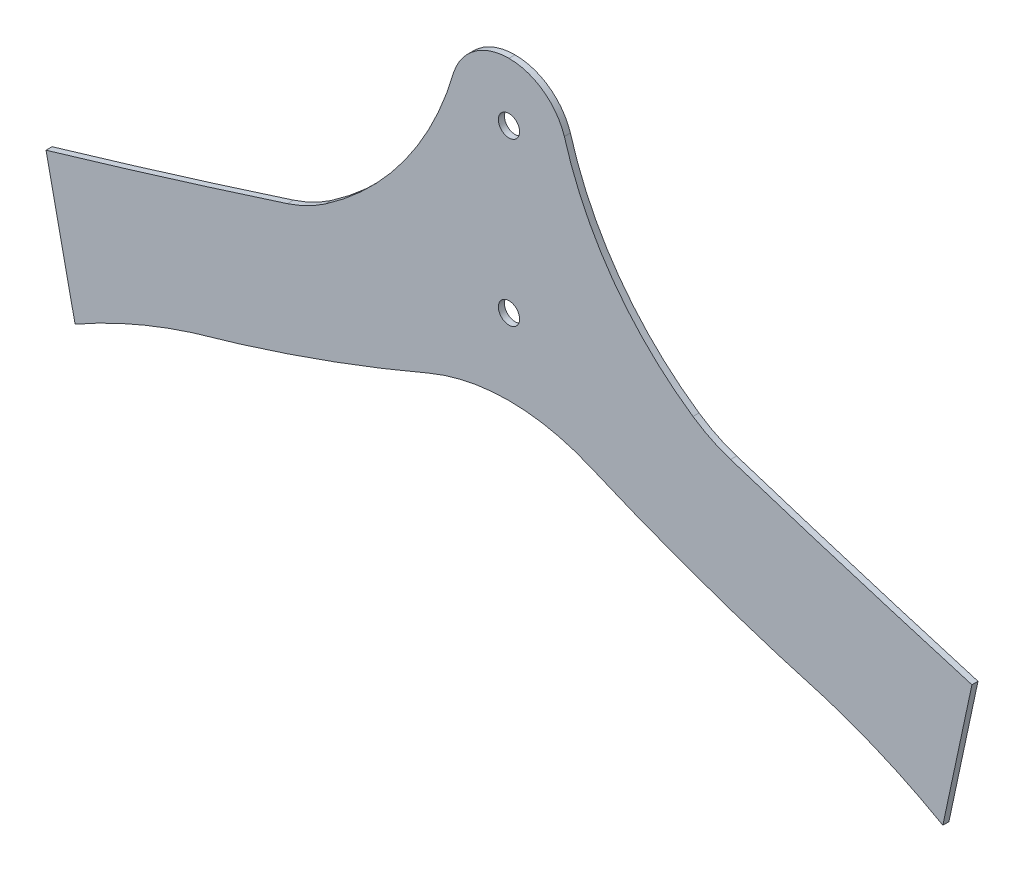
ISO-10303-21;
HEADER;
FILE_DESCRIPTION(('STEP AP214'),'2;1');
FILE_NAME('part.step','',(''),(''),'','','');
FILE_SCHEMA(('AUTOMOTIVE_DESIGN { 1 0 10303 214 1 1 1 1 }'));
ENDSEC;
DATA;
#1=APPLICATION_CONTEXT('core data for automotive mechanical design processes');
#2=APPLICATION_PROTOCOL_DEFINITION('international standard','automotive_design',2000,#1);
#3=PRODUCT_CONTEXT('',#1,'mechanical');
#4=PRODUCT('Part','Part','',(#3));
#5=PRODUCT_RELATED_PRODUCT_CATEGORY('part','',(#4));
#6=PRODUCT_DEFINITION_FORMATION('','',#4);
#7=PRODUCT_DEFINITION_CONTEXT('part definition',#1,'design');
#8=PRODUCT_DEFINITION('design','',#6,#7);
#9=PRODUCT_DEFINITION_SHAPE('','',#8);
#10=(LENGTH_UNIT() NAMED_UNIT(*) SI_UNIT(.MILLI.,.METRE.));
#11=(NAMED_UNIT(*) PLANE_ANGLE_UNIT() SI_UNIT($,.RADIAN.));
#12=(NAMED_UNIT(*) SI_UNIT($,.STERADIAN.) SOLID_ANGLE_UNIT());
#13=UNCERTAINTY_MEASURE_WITH_UNIT(LENGTH_MEASURE(1.E-05),#10,'distance_accuracy_value','');
#14=(GEOMETRIC_REPRESENTATION_CONTEXT(3) GLOBAL_UNCERTAINTY_ASSIGNED_CONTEXT((#13)) GLOBAL_UNIT_ASSIGNED_CONTEXT((#10,
#11,#12)) REPRESENTATION_CONTEXT('',''));
#15=CARTESIAN_POINT('',(0.,0.,0.));
#16=DIRECTION('',(0.,0.,1.));
#17=DIRECTION('',(1.,0.,0.));
#18=AXIS2_PLACEMENT_3D('',#15,#16,#17);
#19=CARTESIAN_POINT('',(-681.623414978373,723.91457598848,0.));
#20=DIRECTION('',(-0.9779411440759,-0.208880632715241,0.));
#21=DIRECTION('',(0.208880632715241,-0.9779411440759,0.));
#22=AXIS2_PLACEMENT_3D('',#19,#20,#21);
#23=PLANE('',#22);
#24=DIRECTION('',(0.,0.,-1.));
#25=VECTOR('',#24,1.);
#26=CARTESIAN_POINT('',(-454.27658818341,-340.481931278848,6.35));
#27=LINE('',#26,#25);
#28=CARTESIAN_POINT('',(-454.27658818341,-340.481931278848,6.35));
#29=VERTEX_POINT('',#28);
#30=CARTESIAN_POINT('',(-454.27658818341,-340.481931278848,0.));
#31=VERTEX_POINT('',#30);
#32=EDGE_CURVE('E263',#29,#31,#27,.T.);
#33=ORIENTED_EDGE('',*,*,#32,.F.);
#34=DIRECTION('',(0.208880632715241,-0.9779411440759,0.));
#35=VECTOR('',#34,1.);
#36=CARTESIAN_POINT('',(-124.231516897274,-1885.69294684576,6.35));
#37=LINE('',#36,#35);
#38=CARTESIAN_POINT('',(-484.73177670396,-197.896275932631,6.35));
#39=VERTEX_POINT('',#38);
#40=EDGE_CURVE('E270',#39,#29,#37,.T.);
#41=ORIENTED_EDGE('',*,*,#40,.F.);
#42=DIRECTION('',(0.,0.,-1.));
#43=VECTOR('',#42,1.);
#44=CARTESIAN_POINT('',(-484.731776703961,-197.896275932631,6.35));
#45=LINE('',#44,#43);
#46=CARTESIAN_POINT('',(-484.73177670396,-197.896275932631,0.));
#47=VERTEX_POINT('',#46);
#48=EDGE_CURVE('E267',#47,#39,#45,.F.);
#49=ORIENTED_EDGE('',*,*,#48,.F.);
#50=DIRECTION('',(0.208880632715241,-0.9779411440759,0.));
#51=VECTOR('',#50,1.);
#52=CARTESIAN_POINT('',(-124.231516897274,-1885.69294684576,0.));
#53=LINE('',#52,#51);
#54=EDGE_CURVE('E258',#47,#31,#53,.T.);
#55=ORIENTED_EDGE('',*,*,#54,.T.);
#56=EDGE_LOOP('',(#33,#41,#49,#55));
#57=FACE_BOUND('',#56,.T.);
#58=ADVANCED_FACE('F40',(#57),#23,.T.);
#59=CARTESIAN_POINT('',(681.623414978373,723.91457598848,0.));
#60=DIRECTION('',(0.9779411440759,-0.208880632715241,0.));
#61=DIRECTION('',(-0.208880632715241,-0.9779411440759,0.));
#62=AXIS2_PLACEMENT_3D('',#59,#60,#61);
#63=PLANE('',#62);
#64=DIRECTION('',(0.,0.,-1.));
#65=VECTOR('',#64,1.);
#66=CARTESIAN_POINT('',(454.276588183388,-340.481931278951,6.35));
#67=LINE('',#66,#65);
#68=CARTESIAN_POINT('',(454.276588183388,-340.481931278951,0.));
#69=VERTEX_POINT('',#68);
#70=CARTESIAN_POINT('',(454.276588183388,-340.481931278951,6.35));
#71=VERTEX_POINT('',#70);
#72=EDGE_CURVE('E261',#69,#71,#67,.F.);
#73=ORIENTED_EDGE('',*,*,#72,.F.);
#74=DIRECTION('',(0.208880632715241,0.9779411440759,0.));
#75=VECTOR('',#74,1.);
#76=CARTESIAN_POINT('',(117.384536046517,-1917.74926628339,0.));
#77=LINE('',#76,#75);
#78=CARTESIAN_POINT('',(484.731776703954,-197.896275932662,0.));
#79=VERTEX_POINT('',#78);
#80=EDGE_CURVE('E262',#69,#79,#77,.T.);
#81=ORIENTED_EDGE('',*,*,#80,.T.);
#82=DIRECTION('',(0.,0.,-1.));
#83=VECTOR('',#82,1.);
#84=CARTESIAN_POINT('',(484.731776703954,-197.896275932662,6.35));
#85=LINE('',#84,#83);
#86=CARTESIAN_POINT('',(484.731776703954,-197.896275932662,6.35));
#87=VERTEX_POINT('',#86);
#88=EDGE_CURVE('E266',#87,#79,#85,.T.);
#89=ORIENTED_EDGE('',*,*,#88,.F.);
#90=DIRECTION('',(0.208880632715241,0.9779411440759,0.));
#91=VECTOR('',#90,1.);
#92=CARTESIAN_POINT('',(117.384536046517,-1917.74926628339,6.35));
#93=LINE('',#92,#91);
#94=EDGE_CURVE('E44',#71,#87,#93,.T.);
#95=ORIENTED_EDGE('',*,*,#94,.F.);
#96=EDGE_LOOP('',(#73,#81,#89,#95));
#97=FACE_BOUND('',#96,.T.);
#98=ADVANCED_FACE('F300',(#97),#63,.T.);
#99=CARTESIAN_POINT('',(-138.891220316239,-894.306056534641,6.35));
#100=DIRECTION('',(0.,0.,-1.));
#101=DIRECTION('',(-1.,0.,0.));
#102=AXIS2_PLACEMENT_3D('',#99,#100,#101);
#103=CYLINDRICAL_SURFACE('',#102,637.329657226191);
#104=CARTESIAN_POINT('',(-138.891220316239,-894.306056534641,6.35));
#105=DIRECTION('',(0.,0.,1.));
#106=DIRECTION('',(1.,0.,0.));
#107=AXIS2_PLACEMENT_3D('',#104,#105,#106);
#108=CIRCLE('',#107,637.329657226191);
#109=CARTESIAN_POINT('',(-331.541707893641,-286.790722064602,6.35));
#110=VERTEX_POINT('',#109);
#111=EDGE_CURVE('E210',#110,#29,#108,.T.);
#112=ORIENTED_EDGE('',*,*,#111,.T.);
#113=ORIENTED_EDGE('',*,*,#32,.T.);
#114=CARTESIAN_POINT('',(-138.891220316239,-894.306056534641,0.));
#115=DIRECTION('',(0.,0.,1.));
#116=DIRECTION('',(1.,0.,0.));
#117=AXIS2_PLACEMENT_3D('',#114,#115,#116);
#118=CIRCLE('',#117,637.329657226191);
#119=CARTESIAN_POINT('',(-331.541707893641,-286.790722064602,0.));
#120=VERTEX_POINT('',#119);
#121=EDGE_CURVE('E249',#120,#31,#118,.T.);
#122=ORIENTED_EDGE('',*,*,#121,.F.);
#123=DIRECTION('',(0.,0.,-1.));
#124=VECTOR('',#123,1.);
#125=CARTESIAN_POINT('',(-331.541707893641,-286.790722064602,6.35));
#126=LINE('',#125,#124);
#127=EDGE_CURVE('E340',#110,#120,#126,.T.);
#128=ORIENTED_EDGE('',*,*,#127,.F.);
#129=EDGE_LOOP('',(#112,#113,#122,#128));
#130=FACE_BOUND('',#129,.T.);
#131=ADVANCED_FACE('F407',(#130),#103,.F.);
#132=CARTESIAN_POINT('',(-866.795374779857,1629.71018876488,6.35));
#133=DIRECTION('',(0.,0.,-1.));
#134=DIRECTION('',(-1.,0.,0.));
#135=AXIS2_PLACEMENT_3D('',#132,#133,#134);
#136=CYLINDRICAL_SURFACE('',#135,1989.84226237292);
#137=CARTESIAN_POINT('',(-866.795374779857,1629.71018876488,0.));
#138=DIRECTION('',(0.,0.,1.));
#139=DIRECTION('',(1.,0.,0.));
#140=AXIS2_PLACEMENT_3D('',#137,#138,#139);
#141=CIRCLE('',#140,1989.84226237292);
#142=CARTESIAN_POINT('',(-84.6840571972077,-199.982166805998,0.));
#143=VERTEX_POINT('',#142);
#144=EDGE_CURVE('E253',#120,#143,#141,.T.);
#145=ORIENTED_EDGE('',*,*,#144,.T.);
#146=DIRECTION('',(0.,0.,-1.));
#147=VECTOR('',#146,1.);
#148=CARTESIAN_POINT('',(-84.6840571972077,-199.982166805998,6.35));
#149=LINE('',#148,#147);
#150=CARTESIAN_POINT('',(-84.6840571972077,-199.982166805998,6.35));
#151=VERTEX_POINT('',#150);
#152=EDGE_CURVE('E129',#151,#143,#149,.T.);
#153=ORIENTED_EDGE('',*,*,#152,.F.);
#154=CARTESIAN_POINT('',(-866.795374779857,1629.71018876488,6.35));
#155=DIRECTION('',(0.,0.,1.));
#156=DIRECTION('',(1.,0.,0.));
#157=AXIS2_PLACEMENT_3D('',#154,#155,#156);
#158=CIRCLE('',#157,1989.84226237292);
#159=EDGE_CURVE('E207',#110,#151,#158,.T.);
#160=ORIENTED_EDGE('',*,*,#159,.F.);
#161=ORIENTED_EDGE('',*,*,#127,.T.);
#162=EDGE_LOOP('',(#145,#153,#160,#161));
#163=FACE_BOUND('',#162,.T.);
#164=ADVANCED_FACE('F409',(#163),#136,.T.);
#165=CARTESIAN_POINT('',(0.306932182695618,-398.812384533761,6.35));
#166=DIRECTION('',(0.,0.,-1.));
#167=DIRECTION('',(-1.,0.,0.));
#168=AXIS2_PLACEMENT_3D('',#165,#166,#167);
#169=CYLINDRICAL_SURFACE('',#168,216.233493606906);
#170=CARTESIAN_POINT('',(0.306932182695618,-398.812384533761,0.));
#171=DIRECTION('',(0.,0.,1.));
#172=DIRECTION('',(1.,0.,0.));
#173=AXIS2_PLACEMENT_3D('',#170,#171,#172);
#174=CIRCLE('',#173,216.233493606906);
#175=CARTESIAN_POINT('',(-2.52037912567248E-08,-182.579108764125,0.));
#176=VERTEX_POINT('',#175);
#177=EDGE_CURVE('E248',#176,#143,#174,.T.);
#178=ORIENTED_EDGE('',*,*,#177,.F.);
#179=DIRECTION('',(0.,0.,-1.));
#180=VECTOR('',#179,1.);
#181=CARTESIAN_POINT('',(-2.52037912567248E-08,-182.579108764125,6.35));
#182=LINE('',#181,#180);
#183=CARTESIAN_POINT('',(-2.52037912567248E-08,-182.579108764125,6.35));
#184=VERTEX_POINT('',#183);
#185=EDGE_CURVE('E325',#184,#176,#182,.T.);
#186=ORIENTED_EDGE('',*,*,#185,.F.);
#187=CARTESIAN_POINT('',(0.306932182695618,-398.812384533761,6.35));
#188=DIRECTION('',(0.,0.,1.));
#189=DIRECTION('',(1.,0.,0.));
#190=AXIS2_PLACEMENT_3D('',#187,#188,#189);
#191=CIRCLE('',#190,216.233493606906);
#192=EDGE_CURVE('E220',#184,#151,#191,.T.);
#193=ORIENTED_EDGE('',*,*,#192,.T.);
#194=ORIENTED_EDGE('',*,*,#152,.T.);
#195=EDGE_LOOP('',(#178,#186,#193,#194));
#196=FACE_BOUND('',#195,.T.);
#197=ADVANCED_FACE('F416',(#196),#169,.F.);
#198=CARTESIAN_POINT('',(-0.306932183065101,-398.812384533801,6.35));
#199=DIRECTION('',(0.,0.,-1.));
#200=DIRECTION('',(-1.,0.,0.));
#201=AXIS2_PLACEMENT_3D('',#198,#199,#200);
#202=CYLINDRICAL_SURFACE('',#201,216.233493606875);
#203=CARTESIAN_POINT('',(-0.306932183065101,-398.812384533801,0.));
#204=DIRECTION('',(0.,0.,1.));
#205=DIRECTION('',(1.,0.,0.));
#206=AXIS2_PLACEMENT_3D('',#203,#204,#205);
#207=CIRCLE('',#206,216.233493606875);
#208=CARTESIAN_POINT('',(84.6840571968769,-199.98216680608,0.));
#209=VERTEX_POINT('',#208);
#210=EDGE_CURVE('E356',#209,#176,#207,.T.);
#211=ORIENTED_EDGE('',*,*,#210,.F.);
#212=DIRECTION('',(0.,0.,-1.));
#213=VECTOR('',#212,1.);
#214=CARTESIAN_POINT('',(84.6840571968769,-199.98216680608,6.35));
#215=LINE('',#214,#213);
#216=CARTESIAN_POINT('',(84.6840571968769,-199.98216680608,6.35));
#217=VERTEX_POINT('',#216);
#218=EDGE_CURVE('E328',#217,#209,#215,.T.);
#219=ORIENTED_EDGE('',*,*,#218,.F.);
#220=CARTESIAN_POINT('',(-0.306932183065101,-398.812384533801,6.35));
#221=DIRECTION('',(0.,0.,1.));
#222=DIRECTION('',(1.,0.,0.));
#223=AXIS2_PLACEMENT_3D('',#220,#221,#222);
#224=CIRCLE('',#223,216.233493606875);
#225=EDGE_CURVE('E215',#217,#184,#224,.T.);
#226=ORIENTED_EDGE('',*,*,#225,.T.);
#227=ORIENTED_EDGE('',*,*,#185,.T.);
#228=EDGE_LOOP('',(#211,#219,#226,#227));
#229=FACE_BOUND('',#228,.T.);
#230=ADVANCED_FACE('F450',(#229),#202,.F.);
#231=CARTESIAN_POINT('',(866.795374779528,1629.71018876479,6.35));
#232=DIRECTION('',(0.,0.,-1.));
#233=DIRECTION('',(-1.,0.,0.));
#234=AXIS2_PLACEMENT_3D('',#231,#232,#233);
#235=CYLINDRICAL_SURFACE('',#234,1989.84226237292);
#236=CARTESIAN_POINT('',(866.795374779528,1629.71018876479,0.));
#237=DIRECTION('',(0.,0.,1.));
#238=DIRECTION('',(1.,0.,0.));
#239=AXIS2_PLACEMENT_3D('',#236,#237,#238);
#240=CIRCLE('',#239,1989.84226237292);
#241=CARTESIAN_POINT('',(331.541707897152,-286.790722065757,0.));
#242=VERTEX_POINT('',#241);
#243=EDGE_CURVE('E276',#209,#242,#240,.T.);
#244=ORIENTED_EDGE('',*,*,#243,.T.);
#245=DIRECTION('',(0.,0.,-1.));
#246=VECTOR('',#245,1.);
#247=CARTESIAN_POINT('',(331.541707897152,-286.790722065757,6.35));
#248=LINE('',#247,#246);
#249=CARTESIAN_POINT('',(331.541707897152,-286.790722065757,6.35));
#250=VERTEX_POINT('',#249);
#251=EDGE_CURVE('E333',#250,#242,#248,.T.);
#252=ORIENTED_EDGE('',*,*,#251,.F.);
#253=CARTESIAN_POINT('',(866.795374779528,1629.71018876479,6.35));
#254=DIRECTION('',(0.,0.,1.));
#255=DIRECTION('',(1.,0.,0.));
#256=AXIS2_PLACEMENT_3D('',#253,#254,#255);
#257=CIRCLE('',#256,1989.84226237292);
#258=EDGE_CURVE('E211',#217,#250,#257,.T.);
#259=ORIENTED_EDGE('',*,*,#258,.F.);
#260=ORIENTED_EDGE('',*,*,#218,.T.);
#261=EDGE_LOOP('',(#244,#252,#259,#260));
#262=FACE_BOUND('',#261,.T.);
#263=ADVANCED_FACE('F428',(#262),#235,.T.);
#264=CARTESIAN_POINT('',(138.891220315955,-894.306056534585,6.35));
#265=DIRECTION('',(0.,0.,-1.));
#266=DIRECTION('',(-1.,0.,0.));
#267=AXIS2_PLACEMENT_3D('',#264,#265,#266);
#268=CYLINDRICAL_SURFACE('',#267,637.329657226183);
#269=CARTESIAN_POINT('',(138.891220315955,-894.306056534585,0.));
#270=DIRECTION('',(0.,0.,1.));
#271=DIRECTION('',(1.,0.,0.));
#272=AXIS2_PLACEMENT_3D('',#269,#270,#271);
#273=CIRCLE('',#272,637.329657226183);
#274=EDGE_CURVE('E252',#69,#242,#273,.T.);
#275=ORIENTED_EDGE('',*,*,#274,.F.);
#276=ORIENTED_EDGE('',*,*,#72,.T.);
#277=CARTESIAN_POINT('',(138.891220315955,-894.306056534585,6.35));
#278=DIRECTION('',(0.,0.,1.));
#279=DIRECTION('',(1.,0.,0.));
#280=AXIS2_PLACEMENT_3D('',#277,#278,#279);
#281=CIRCLE('',#280,637.329657226183);
#282=EDGE_CURVE('E216',#71,#250,#281,.T.);
#283=ORIENTED_EDGE('',*,*,#282,.T.);
#284=ORIENTED_EDGE('',*,*,#251,.T.);
#285=EDGE_LOOP('',(#275,#276,#283,#284));
#286=FACE_BOUND('',#285,.T.);
#287=ADVANCED_FACE('F426',(#286),#268,.F.);
#288=CARTESIAN_POINT('',(3342.55021956777,9521.38535501115,6.35));
#289=DIRECTION('',(0.,0.,-1.));
#290=DIRECTION('',(-1.,0.,0.));
#291=AXIS2_PLACEMENT_3D('',#288,#289,#290);
#292=CYLINDRICAL_SURFACE('',#291,10130.7236500644);
#293=CARTESIAN_POINT('',(3342.55021956777,9521.38535501115,6.35));
#294=DIRECTION('',(0.,0.,1.));
#295=DIRECTION('',(1.,0.,0.));
#296=AXIS2_PLACEMENT_3D('',#293,#294,#295);
#297=CIRCLE('',#296,10130.7236500644);
#298=CARTESIAN_POINT('',(232.005059324651,-119.987497444173,6.35));
#299=VERTEX_POINT('',#298);
#300=EDGE_CURVE('E243',#299,#87,#297,.T.);
#301=ORIENTED_EDGE('',*,*,#300,.T.);
#302=ORIENTED_EDGE('',*,*,#88,.T.);
#303=CARTESIAN_POINT('',(3342.55021956777,9521.38535501115,0.));
#304=DIRECTION('',(0.,0.,1.));
#305=DIRECTION('',(1.,0.,0.));
#306=AXIS2_PLACEMENT_3D('',#303,#304,#305);
#307=CIRCLE('',#306,10130.7236500644);
#308=CARTESIAN_POINT('',(232.005059324651,-119.987497444173,0.));
#309=VERTEX_POINT('',#308);
#310=EDGE_CURVE('E11',#309,#79,#307,.T.);
#311=ORIENTED_EDGE('',*,*,#310,.F.);
#312=DIRECTION('',(0.,0.,-1.));
#313=VECTOR('',#312,1.);
#314=CARTESIAN_POINT('',(232.005059324651,-119.987497444173,6.35));
#315=LINE('',#314,#313);
#316=EDGE_CURVE('E63',#299,#309,#315,.T.);
#317=ORIENTED_EDGE('',*,*,#316,.F.);
#318=EDGE_LOOP('',(#301,#302,#311,#317));
#319=FACE_BOUND('',#318,.T.);
#320=ADVANCED_FACE('F291',(#319),#292,.F.);
#321=CARTESIAN_POINT('',(278.798072230355,25.0510282764291,6.35));
#322=DIRECTION('',(0.,0.,-1.));
#323=DIRECTION('',(-1.,0.,0.));
#324=AXIS2_PLACEMENT_3D('',#321,#322,#323);
#325=CYLINDRICAL_SURFACE('',#324,152.399999999997);
#326=CARTESIAN_POINT('',(278.798072230355,25.0510282764291,0.));
#327=DIRECTION('',(0.,0.,1.));
#328=DIRECTION('',(1.,0.,0.));
#329=AXIS2_PLACEMENT_3D('',#326,#327,#328);
#330=CIRCLE('',#329,152.399999999997);
#331=CARTESIAN_POINT('',(192.64501500367,-100.660589048695,0.));
#332=VERTEX_POINT('',#331);
#333=EDGE_CURVE('E51',#332,#309,#330,.T.);
#334=ORIENTED_EDGE('',*,*,#333,.F.);
#335=DIRECTION('',(0.,0.,-1.));
#336=VECTOR('',#335,1.);
#337=CARTESIAN_POINT('',(192.64501500367,-100.660589048695,6.35));
#338=LINE('',#337,#336);
#339=CARTESIAN_POINT('',(192.64501500367,-100.660589048695,6.35));
#340=VERTEX_POINT('',#339);
#341=EDGE_CURVE('E113',#340,#332,#338,.T.);
#342=ORIENTED_EDGE('',*,*,#341,.F.);
#343=CARTESIAN_POINT('',(278.798072230355,25.0510282764291,6.35));
#344=DIRECTION('',(0.,0.,1.));
#345=DIRECTION('',(1.,0.,0.));
#346=AXIS2_PLACEMENT_3D('',#343,#344,#345);
#347=CIRCLE('',#346,152.399999999997);
#348=EDGE_CURVE('E240',#340,#299,#347,.T.);
#349=ORIENTED_EDGE('',*,*,#348,.T.);
#350=ORIENTED_EDGE('',*,*,#316,.T.);
#351=EDGE_LOOP('',(#334,#342,#349,#350));
#352=FACE_BOUND('',#351,.T.);
#353=ADVANCED_FACE('F425',(#352),#325,.F.);
#354=CARTESIAN_POINT('',(385.090522020187,180.149363757776,6.35));
#355=DIRECTION('',(0.,0.,-1.));
#356=DIRECTION('',(-1.,0.,0.));
#357=AXIS2_PLACEMENT_3D('',#354,#355,#356);
#358=CYLINDRICAL_SURFACE('',#357,340.425473145029);
#359=CARTESIAN_POINT('',(385.090522020187,180.149363757776,0.));
#360=DIRECTION('',(0.,0.,1.));
#361=DIRECTION('',(1.,0.,0.));
#362=AXIS2_PLACEMENT_3D('',#359,#360,#361);
#363=CIRCLE('',#362,340.425473145029);
#364=CARTESIAN_POINT('',(57.9659338873831,85.9208828989187,0.));
#365=VERTEX_POINT('',#364);
#366=EDGE_CURVE('E184',#365,#332,#363,.T.);
#367=ORIENTED_EDGE('',*,*,#366,.F.);
#368=DIRECTION('',(0.,0.,-1.));
#369=VECTOR('',#368,1.);
#370=CARTESIAN_POINT('',(57.9659338873831,85.9208828989187,6.35));
#371=LINE('',#370,#369);
#372=CARTESIAN_POINT('',(57.9659338873831,85.9208828989187,6.35));
#373=VERTEX_POINT('',#372);
#374=EDGE_CURVE('E164',#373,#365,#371,.T.);
#375=ORIENTED_EDGE('',*,*,#374,.F.);
#376=CARTESIAN_POINT('',(385.090522020187,180.149363757776,6.35));
#377=DIRECTION('',(0.,0.,1.));
#378=DIRECTION('',(1.,0.,0.));
#379=AXIS2_PLACEMENT_3D('',#376,#377,#378);
#380=CIRCLE('',#379,340.425473145029);
#381=EDGE_CURVE('E237',#373,#340,#380,.T.);
#382=ORIENTED_EDGE('',*,*,#381,.T.);
#383=ORIENTED_EDGE('',*,*,#341,.T.);
#384=EDGE_LOOP('',(#367,#375,#382,#383));
#385=FACE_BOUND('',#384,.T.);
#386=ADVANCED_FACE('F190',(#385),#358,.F.);
#387=CARTESIAN_POINT('',(0.348744021597014,67.1582541510634,6.35));
#388=DIRECTION('',(0.,0.,-1.));
#389=DIRECTION('',(-1.,0.,0.));
#390=AXIS2_PLACEMENT_3D('',#387,#388,#389);
#391=CYLINDRICAL_SURFACE('',#390,60.5951879736327);
#392=CARTESIAN_POINT('',(0.348744021597014,67.1582541510634,0.));
#393=DIRECTION('',(0.,0.,1.));
#394=DIRECTION('',(1.,0.,0.));
#395=AXIS2_PLACEMENT_3D('',#392,#393,#394);
#396=CIRCLE('',#395,60.5951879736327);
#397=CARTESIAN_POINT('',(-7.99413161535478E-11,127.752438551608,0.));
#398=VERTEX_POINT('',#397);
#399=EDGE_CURVE('E168',#365,#398,#396,.T.);
#400=ORIENTED_EDGE('',*,*,#399,.T.);
#401=DIRECTION('',(0.,0.,-1.));
#402=VECTOR('',#401,1.);
#403=CARTESIAN_POINT('',(-7.99413161535478E-11,127.752438551608,6.35));
#404=LINE('',#403,#402);
#405=CARTESIAN_POINT('',(-7.99413161535478E-11,127.752438551608,6.35));
#406=VERTEX_POINT('',#405);
#407=EDGE_CURVE('E176',#406,#398,#404,.T.);
#408=ORIENTED_EDGE('',*,*,#407,.F.);
#409=CARTESIAN_POINT('',(0.348744021597014,67.1582541510634,6.35));
#410=DIRECTION('',(0.,0.,1.));
#411=DIRECTION('',(1.,0.,0.));
#412=AXIS2_PLACEMENT_3D('',#409,#410,#411);
#413=CIRCLE('',#412,60.5951879736327);
#414=EDGE_CURVE('E170',#373,#406,#413,.T.);
#415=ORIENTED_EDGE('',*,*,#414,.F.);
#416=ORIENTED_EDGE('',*,*,#374,.T.);
#417=EDGE_LOOP('',(#400,#408,#415,#416));
#418=FACE_BOUND('',#417,.T.);
#419=ADVANCED_FACE('F166',(#418),#391,.T.);
#420=CARTESIAN_POINT('',(-0.348744021691161,67.1582541510634,6.35));
#421=DIRECTION('',(0.,0.,-1.));
#422=DIRECTION('',(-1.,0.,0.));
#423=AXIS2_PLACEMENT_3D('',#420,#421,#422);
#424=CYLINDRICAL_SURFACE('',#423,60.5951879736323);
#425=CARTESIAN_POINT('',(-0.348744021691161,67.1582541510634,0.));
#426=DIRECTION('',(0.,0.,1.));
#427=DIRECTION('',(1.,0.,0.));
#428=AXIS2_PLACEMENT_3D('',#425,#426,#427);
#429=CIRCLE('',#428,60.5951879736323);
#430=CARTESIAN_POINT('',(-57.9659338874613,85.9208828989662,0.));
#431=VERTEX_POINT('',#430);
#432=EDGE_CURVE('E187',#398,#431,#429,.T.);
#433=ORIENTED_EDGE('',*,*,#432,.T.);
#434=DIRECTION('',(0.,0.,-1.));
#435=VECTOR('',#434,1.);
#436=CARTESIAN_POINT('',(-57.9659338874613,85.9208828989662,6.35));
#437=LINE('',#436,#435);
#438=CARTESIAN_POINT('',(-57.9659338874613,85.9208828989662,6.35));
#439=VERTEX_POINT('',#438);
#440=EDGE_CURVE('E373',#439,#431,#437,.T.);
#441=ORIENTED_EDGE('',*,*,#440,.F.);
#442=CARTESIAN_POINT('',(-0.348744021691161,67.1582541510634,6.35));
#443=DIRECTION('',(0.,0.,1.));
#444=DIRECTION('',(1.,0.,0.));
#445=AXIS2_PLACEMENT_3D('',#442,#443,#444);
#446=CIRCLE('',#445,60.5951879736323);
#447=EDGE_CURVE('E232',#406,#439,#446,.T.);
#448=ORIENTED_EDGE('',*,*,#447,.F.);
#449=ORIENTED_EDGE('',*,*,#407,.T.);
#450=EDGE_LOOP('',(#433,#441,#448,#449));
#451=FACE_BOUND('',#450,.T.);
#452=ADVANCED_FACE('F371',(#451),#424,.T.);
#453=CARTESIAN_POINT('',(-385.090522020281,180.149363757775,6.35));
#454=DIRECTION('',(0.,0.,-1.));
#455=DIRECTION('',(-1.,0.,0.));
#456=AXIS2_PLACEMENT_3D('',#453,#454,#455);
#457=CYLINDRICAL_SURFACE('',#456,340.425473145029);
#458=CARTESIAN_POINT('',(-385.090522020281,180.149363757775,0.));
#459=DIRECTION('',(0.,0.,1.));
#460=DIRECTION('',(1.,0.,0.));
#461=AXIS2_PLACEMENT_3D('',#458,#459,#460);
#462=CIRCLE('',#461,340.425473145029);
#463=CARTESIAN_POINT('',(-192.645015003765,-100.660589048698,0.));
#464=VERTEX_POINT('',#463);
#465=EDGE_CURVE('E365',#464,#431,#462,.T.);
#466=ORIENTED_EDGE('',*,*,#465,.F.);
#467=DIRECTION('',(0.,0.,-1.));
#468=VECTOR('',#467,1.);
#469=CARTESIAN_POINT('',(-192.645015003765,-100.660589048698,6.35));
#470=LINE('',#469,#468);
#471=CARTESIAN_POINT('',(-192.645015003765,-100.660589048698,6.35));
#472=VERTEX_POINT('',#471);
#473=EDGE_CURVE('E378',#472,#464,#470,.T.);
#474=ORIENTED_EDGE('',*,*,#473,.F.);
#475=CARTESIAN_POINT('',(-385.090522020281,180.149363757775,6.35));
#476=DIRECTION('',(0.,0.,1.));
#477=DIRECTION('',(1.,0.,0.));
#478=AXIS2_PLACEMENT_3D('',#475,#476,#477);
#479=CIRCLE('',#478,340.425473145029);
#480=EDGE_CURVE('E228',#472,#439,#479,.T.);
#481=ORIENTED_EDGE('',*,*,#480,.T.);
#482=ORIENTED_EDGE('',*,*,#440,.T.);
#483=EDGE_LOOP('',(#466,#474,#481,#482));
#484=FACE_BOUND('',#483,.T.);
#485=ADVANCED_FACE('F377',(#484),#457,.F.);
#486=CARTESIAN_POINT('',(-278.798072230449,25.0510282764291,6.35));
#487=DIRECTION('',(0.,0.,-1.));
#488=DIRECTION('',(-1.,0.,0.));
#489=AXIS2_PLACEMENT_3D('',#486,#487,#488);
#490=CYLINDRICAL_SURFACE('',#489,152.399999999998);
#491=CARTESIAN_POINT('',(-278.798072230449,25.0510282764291,0.));
#492=DIRECTION('',(0.,0.,1.));
#493=DIRECTION('',(1.,0.,0.));
#494=AXIS2_PLACEMENT_3D('',#491,#492,#493);
#495=CIRCLE('',#494,152.399999999998);
#496=CARTESIAN_POINT('',(-232.00505932475,-119.987497444168,0.));
#497=VERTEX_POINT('',#496);
#498=EDGE_CURVE('E247',#497,#464,#495,.T.);
#499=ORIENTED_EDGE('',*,*,#498,.F.);
#500=DIRECTION('',(0.,0.,-1.));
#501=VECTOR('',#500,1.);
#502=CARTESIAN_POINT('',(-232.00505932475,-119.987497444168,6.35));
#503=LINE('',#502,#501);
#504=CARTESIAN_POINT('',(-232.00505932475,-119.987497444168,6.35));
#505=VERTEX_POINT('',#504);
#506=EDGE_CURVE('E203',#505,#497,#503,.T.);
#507=ORIENTED_EDGE('',*,*,#506,.F.);
#508=CARTESIAN_POINT('',(-278.798072230449,25.0510282764291,6.35));
#509=DIRECTION('',(0.,0.,1.));
#510=DIRECTION('',(1.,0.,0.));
#511=AXIS2_PLACEMENT_3D('',#508,#509,#510);
#512=CIRCLE('',#511,152.399999999998);
#513=EDGE_CURVE('E224',#505,#472,#512,.T.);
#514=ORIENTED_EDGE('',*,*,#513,.T.);
#515=ORIENTED_EDGE('',*,*,#473,.T.);
#516=EDGE_LOOP('',(#499,#507,#514,#515));
#517=FACE_BOUND('',#516,.T.);
#518=ADVANCED_FACE('F396',(#517),#490,.F.);
#519=CARTESIAN_POINT('',(-3342.55021956787,9521.38535501115,6.35));
#520=DIRECTION('',(0.,0.,-1.));
#521=DIRECTION('',(-1.,0.,0.));
#522=AXIS2_PLACEMENT_3D('',#519,#520,#521);
#523=CYLINDRICAL_SURFACE('',#522,10130.7236500644);
#524=CARTESIAN_POINT('',(-3342.55021956787,9521.38535501115,0.));
#525=DIRECTION('',(0.,0.,1.));
#526=DIRECTION('',(1.,0.,0.));
#527=AXIS2_PLACEMENT_3D('',#524,#525,#526);
#528=CIRCLE('',#527,10130.7236500644);
#529=EDGE_CURVE('E244',#47,#497,#528,.T.);
#530=ORIENTED_EDGE('',*,*,#529,.F.);
#531=ORIENTED_EDGE('',*,*,#48,.T.);
#532=CARTESIAN_POINT('',(-3342.55021956787,9521.38535501115,6.35));
#533=DIRECTION('',(0.,0.,1.));
#534=DIRECTION('',(1.,0.,0.));
#535=AXIS2_PLACEMENT_3D('',#532,#533,#534);
#536=CIRCLE('',#535,10130.7236500644);
#537=EDGE_CURVE('E223',#39,#505,#536,.T.);
#538=ORIENTED_EDGE('',*,*,#537,.T.);
#539=ORIENTED_EDGE('',*,*,#506,.T.);
#540=EDGE_LOOP('',(#530,#531,#538,#539));
#541=FACE_BOUND('',#540,.T.);
#542=ADVANCED_FACE('F394',(#541),#523,.F.);
#543=CARTESIAN_POINT('',(-4.9737991503207E-11,-103.091704200549,6.35));
#544=DIRECTION('',(0.,0.,-1.));
#545=DIRECTION('',(-1.,0.,0.));
#546=AXIS2_PLACEMENT_3D('',#543,#544,#545);
#547=CYLINDRICAL_SURFACE('',#546,11.112500000003);
#548=CARTESIAN_POINT('',(-4.9737991503207E-11,-103.091704200549,6.35));
#549=DIRECTION('',(0.,0.,1.));
#550=DIRECTION('',(1.,0.,0.));
#551=AXIS2_PLACEMENT_3D('',#548,#549,#550);
#552=CIRCLE('',#551,11.112500000003);
#553=CARTESIAN_POINT('',(11.1124999999532,-103.091704200549,6.35));
#554=VERTEX_POINT('',#553);
#555=EDGE_CURVE('E198',#554,#554,#552,.T.);
#556=ORIENTED_EDGE('',*,*,#555,.T.);
#557=EDGE_LOOP('',(#556));
#558=FACE_BOUND('',#557,.T.);
#559=CARTESIAN_POINT('',(-4.9737991503207E-11,-103.091704200549,0.));
#560=DIRECTION('',(0.,0.,1.));
#561=DIRECTION('',(1.,0.,0.));
#562=AXIS2_PLACEMENT_3D('',#559,#560,#561);
#563=CIRCLE('',#562,11.112500000003);
#564=CARTESIAN_POINT('',(11.1124999999532,-103.091704200549,0.));
#565=VERTEX_POINT('',#564);
#566=EDGE_CURVE('E279',#565,#565,#563,.T.);
#567=ORIENTED_EDGE('',*,*,#566,.F.);
#568=EDGE_LOOP('',(#567));
#569=FACE_BOUND('',#568,.T.);
#570=ADVANCED_FACE('F403',(#558,#569),#547,.F.);
#571=CARTESIAN_POINT('',(-4.79616346638068E-11,66.6750000002518,6.35));
#572=DIRECTION('',(0.,0.,-1.));
#573=DIRECTION('',(-1.,0.,0.));
#574=AXIS2_PLACEMENT_3D('',#571,#572,#573);
#575=CYLINDRICAL_SURFACE('',#574,11.1125000000012);
#576=CARTESIAN_POINT('',(-4.79616346638068E-11,66.6750000002518,6.35));
#577=DIRECTION('',(0.,0.,1.));
#578=DIRECTION('',(1.,0.,0.));
#579=AXIS2_PLACEMENT_3D('',#576,#577,#578);
#580=CIRCLE('',#579,11.1125000000012);
#581=CARTESIAN_POINT('',(11.1124999999532,66.6750000002518,6.35));
#582=VERTEX_POINT('',#581);
#583=EDGE_CURVE('E202',#582,#582,#580,.T.);
#584=ORIENTED_EDGE('',*,*,#583,.T.);
#585=EDGE_LOOP('',(#584));
#586=FACE_BOUND('',#585,.T.);
#587=CARTESIAN_POINT('',(-4.79616346638068E-11,66.6750000002518,0.));
#588=DIRECTION('',(0.,0.,1.));
#589=DIRECTION('',(1.,0.,0.));
#590=AXIS2_PLACEMENT_3D('',#587,#588,#589);
#591=CIRCLE('',#590,11.1125000000012);
#592=CARTESIAN_POINT('',(11.1124999999532,66.6750000002518,0.));
#593=VERTEX_POINT('',#592);
#594=EDGE_CURVE('E347',#593,#593,#591,.T.);
#595=ORIENTED_EDGE('',*,*,#594,.F.);
#596=EDGE_LOOP('',(#595));
#597=FACE_BOUND('',#596,.T.);
#598=ADVANCED_FACE('F430',(#586,#597),#575,.F.);
#599=CARTESIAN_POINT('',(-78.4644200180242,-1875.91745042495,0.));
#600=DIRECTION('',(0.,0.,1.));
#601=DIRECTION('',(1.,0.,0.));
#602=AXIS2_PLACEMENT_3D('',#599,#600,#601);
#603=PLANE('',#602);
#604=ORIENTED_EDGE('',*,*,#594,.T.);
#605=EDGE_LOOP('',(#604));
#606=FACE_BOUND('',#605,.T.);
#607=ORIENTED_EDGE('',*,*,#566,.T.);
#608=EDGE_LOOP('',(#607));
#609=FACE_BOUND('',#608,.T.);
#610=ORIENTED_EDGE('',*,*,#54,.F.);
#611=ORIENTED_EDGE('',*,*,#529,.T.);
#612=ORIENTED_EDGE('',*,*,#498,.T.);
#613=ORIENTED_EDGE('',*,*,#465,.T.);
#614=ORIENTED_EDGE('',*,*,#432,.F.);
#615=ORIENTED_EDGE('',*,*,#399,.F.);
#616=ORIENTED_EDGE('',*,*,#366,.T.);
#617=ORIENTED_EDGE('',*,*,#333,.T.);
#618=ORIENTED_EDGE('',*,*,#310,.T.);
#619=ORIENTED_EDGE('',*,*,#80,.F.);
#620=ORIENTED_EDGE('',*,*,#274,.T.);
#621=ORIENTED_EDGE('',*,*,#243,.F.);
#622=ORIENTED_EDGE('',*,*,#210,.T.);
#623=ORIENTED_EDGE('',*,*,#177,.T.);
#624=ORIENTED_EDGE('',*,*,#144,.F.);
#625=ORIENTED_EDGE('',*,*,#121,.T.);
#626=EDGE_LOOP('',(#610,#611,#612,#613,#614,#615,#616,#617,#618,#619,#620,#621,#622,#623,#624,#625));
#627=FACE_BOUND('',#626,.T.);
#628=ADVANCED_FACE('F182',(#606,#609,#627),#603,.F.);
#629=CARTESIAN_POINT('',(-78.4644200180242,-1875.91745042495,6.35));
#630=DIRECTION('',(0.,0.,1.));
#631=DIRECTION('',(1.,0.,0.));
#632=AXIS2_PLACEMENT_3D('',#629,#630,#631);
#633=PLANE('',#632);
#634=ORIENTED_EDGE('',*,*,#583,.F.);
#635=EDGE_LOOP('',(#634));
#636=FACE_BOUND('',#635,.T.);
#637=ORIENTED_EDGE('',*,*,#555,.F.);
#638=EDGE_LOOP('',(#637));
#639=FACE_BOUND('',#638,.T.);
#640=ORIENTED_EDGE('',*,*,#537,.F.);
#641=ORIENTED_EDGE('',*,*,#40,.T.);
#642=ORIENTED_EDGE('',*,*,#111,.F.);
#643=ORIENTED_EDGE('',*,*,#159,.T.);
#644=ORIENTED_EDGE('',*,*,#192,.F.);
#645=ORIENTED_EDGE('',*,*,#225,.F.);
#646=ORIENTED_EDGE('',*,*,#258,.T.);
#647=ORIENTED_EDGE('',*,*,#282,.F.);
#648=ORIENTED_EDGE('',*,*,#94,.T.);
#649=ORIENTED_EDGE('',*,*,#300,.F.);
#650=ORIENTED_EDGE('',*,*,#348,.F.);
#651=ORIENTED_EDGE('',*,*,#381,.F.);
#652=ORIENTED_EDGE('',*,*,#414,.T.);
#653=ORIENTED_EDGE('',*,*,#447,.T.);
#654=ORIENTED_EDGE('',*,*,#480,.F.);
#655=ORIENTED_EDGE('',*,*,#513,.F.);
#656=EDGE_LOOP('',(#640,#641,#642,#643,#644,#645,#646,#647,#648,#649,#650,#651,#652,#653,#654,#655));
#657=FACE_BOUND('',#656,.T.);
#658=ADVANCED_FACE('F42',(#636,#639,#657),#633,.T.);
#659=CLOSED_SHELL('',(#58,#98,#131,#164,#197,#230,#263,#287,#320,#353,#386,#419,#452,#485,#518,
#542,#570,#598,#628,#658));
#660=MANIFOLD_SOLID_BREP('B2',#659);
#661=ADVANCED_BREP_SHAPE_REPRESENTATION('',(#18,#660),#14);
#662=SHAPE_DEFINITION_REPRESENTATION(#9,#661);
ENDSEC;
END-ISO-10303-21;
